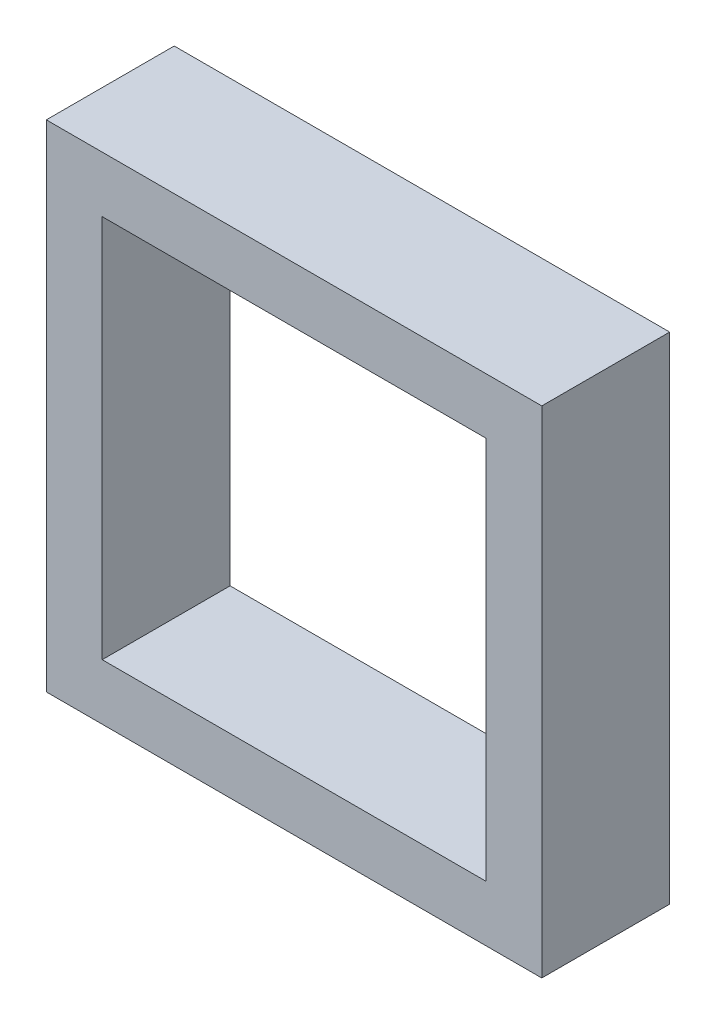
ISO-10303-21;
HEADER;
FILE_DESCRIPTION(('STEP AP214'),'2;1');
FILE_NAME('part.step','',(''),(''),'','','');
FILE_SCHEMA(('AUTOMOTIVE_DESIGN { 1 0 10303 214 1 1 1 1 }'));
ENDSEC;
DATA;
#1=APPLICATION_CONTEXT('core data for automotive mechanical design processes');
#2=APPLICATION_PROTOCOL_DEFINITION('international standard','automotive_design',2000,#1);
#3=PRODUCT_CONTEXT('',#1,'mechanical');
#4=PRODUCT('Part','Part','',(#3));
#5=PRODUCT_RELATED_PRODUCT_CATEGORY('part','',(#4));
#6=PRODUCT_DEFINITION_FORMATION('','',#4);
#7=PRODUCT_DEFINITION_CONTEXT('part definition',#1,'design');
#8=PRODUCT_DEFINITION('design','',#6,#7);
#9=PRODUCT_DEFINITION_SHAPE('','',#8);
#10=(LENGTH_UNIT() NAMED_UNIT(*) SI_UNIT(.MILLI.,.METRE.));
#11=(NAMED_UNIT(*) PLANE_ANGLE_UNIT() SI_UNIT($,.RADIAN.));
#12=(NAMED_UNIT(*) SI_UNIT($,.STERADIAN.) SOLID_ANGLE_UNIT());
#13=UNCERTAINTY_MEASURE_WITH_UNIT(LENGTH_MEASURE(1.E-05),#10,'distance_accuracy_value','');
#14=(GEOMETRIC_REPRESENTATION_CONTEXT(3) GLOBAL_UNCERTAINTY_ASSIGNED_CONTEXT((#13)) GLOBAL_UNIT_ASSIGNED_CONTEXT((#10,
#11,#12)) REPRESENTATION_CONTEXT('',''));
#15=CARTESIAN_POINT('',(0.,0.,0.));
#16=DIRECTION('',(0.,0.,1.));
#17=DIRECTION('',(1.,0.,0.));
#18=AXIS2_PLACEMENT_3D('',#15,#16,#17);
#19=CARTESIAN_POINT('',(0.,0.,10.));
#20=DIRECTION('',(0.,0.,-1.));
#21=DIRECTION('',(-1.,0.,0.));
#22=AXIS2_PLACEMENT_3D('',#19,#20,#21);
#23=PLANE('',#22);
#24=DIRECTION('',(0.,-1.,0.));
#25=VECTOR('',#24,1.);
#26=CARTESIAN_POINT('',(-19.3689392315604,19.3689392315604,10.));
#27=LINE('',#26,#25);
#28=CARTESIAN_POINT('',(-19.3689392315604,19.3689392315604,10.));
#29=VERTEX_POINT('',#28);
#30=CARTESIAN_POINT('',(-19.3689392315604,-19.3689392315603,10.));
#31=VERTEX_POINT('',#30);
#32=EDGE_CURVE('E134',#29,#31,#27,.T.);
#33=ORIENTED_EDGE('',*,*,#32,.T.);
#34=DIRECTION('',(1.,0.,0.));
#35=VECTOR('',#34,1.);
#36=CARTESIAN_POINT('',(19.3689392315604,-19.3689392315603,10.));
#37=LINE('',#36,#35);
#38=CARTESIAN_POINT('',(19.3689392315604,-19.3689392315603,10.));
#39=VERTEX_POINT('',#38);
#40=EDGE_CURVE('E137',#31,#39,#37,.T.);
#41=ORIENTED_EDGE('',*,*,#40,.T.);
#42=DIRECTION('',(0.,1.,0.));
#43=VECTOR('',#42,1.);
#44=CARTESIAN_POINT('',(19.3689392315604,19.3689392315604,10.));
#45=LINE('',#44,#43);
#46=CARTESIAN_POINT('',(19.3689392315604,19.3689392315604,10.));
#47=VERTEX_POINT('',#46);
#48=EDGE_CURVE('E140',#39,#47,#45,.T.);
#49=ORIENTED_EDGE('',*,*,#48,.T.);
#50=DIRECTION('',(-1.,0.,0.));
#51=VECTOR('',#50,1.);
#52=CARTESIAN_POINT('',(19.3689392315604,19.3689392315604,10.));
#53=LINE('',#52,#51);
#54=EDGE_CURVE('E142',#47,#29,#53,.T.);
#55=ORIENTED_EDGE('',*,*,#54,.T.);
#56=EDGE_LOOP('',(#33,#41,#49,#55));
#57=FACE_BOUND('',#56,.T.);
#58=DIRECTION('',(0.,1.,0.));
#59=VECTOR('',#58,1.);
#60=CARTESIAN_POINT('',(15.,15.,10.));
#61=LINE('',#60,#59);
#62=CARTESIAN_POINT('',(15.,-15.,10.));
#63=VERTEX_POINT('',#62);
#64=CARTESIAN_POINT('',(15.,15.,10.));
#65=VERTEX_POINT('',#64);
#66=EDGE_CURVE('E98',#63,#65,#61,.T.);
#67=ORIENTED_EDGE('',*,*,#66,.F.);
#68=DIRECTION('',(1.,0.,0.));
#69=VECTOR('',#68,1.);
#70=CARTESIAN_POINT('',(-15.,-15.,10.));
#71=LINE('',#70,#69);
#72=CARTESIAN_POINT('',(-15.,-15.,10.));
#73=VERTEX_POINT('',#72);
#74=EDGE_CURVE('E120',#73,#63,#71,.T.);
#75=ORIENTED_EDGE('',*,*,#74,.F.);
#76=DIRECTION('',(0.,-1.,0.));
#77=VECTOR('',#76,1.);
#78=CARTESIAN_POINT('',(-15.,15.,10.));
#79=LINE('',#78,#77);
#80=CARTESIAN_POINT('',(-15.,15.,10.));
#81=VERTEX_POINT('',#80);
#82=EDGE_CURVE('E118',#81,#73,#79,.T.);
#83=ORIENTED_EDGE('',*,*,#82,.F.);
#84=DIRECTION('',(-1.,0.,0.));
#85=VECTOR('',#84,1.);
#86=CARTESIAN_POINT('',(-15.,15.,10.));
#87=LINE('',#86,#85);
#88=EDGE_CURVE('E106',#65,#81,#87,.T.);
#89=ORIENTED_EDGE('',*,*,#88,.F.);
#90=EDGE_LOOP('',(#67,#75,#83,#89));
#91=FACE_BOUND('',#90,.T.);
#92=ADVANCED_FACE('F33',(#57,#91),#23,.F.);
#93=CARTESIAN_POINT('',(0.,0.,0.));
#94=DIRECTION('',(0.,0.,-1.));
#95=DIRECTION('',(-1.,0.,0.));
#96=AXIS2_PLACEMENT_3D('',#93,#94,#95);
#97=PLANE('',#96);
#98=DIRECTION('',(0.,-1.,0.));
#99=VECTOR('',#98,1.);
#100=CARTESIAN_POINT('',(-19.3689392315604,19.3689392315604,0.));
#101=LINE('',#100,#99);
#102=CARTESIAN_POINT('',(-19.3689392315604,19.3689392315604,0.));
#103=VERTEX_POINT('',#102);
#104=CARTESIAN_POINT('',(-19.3689392315604,-19.3689392315603,0.));
#105=VERTEX_POINT('',#104);
#106=EDGE_CURVE('E114',#103,#105,#101,.T.);
#107=ORIENTED_EDGE('',*,*,#106,.F.);
#108=DIRECTION('',(-1.,0.,0.));
#109=VECTOR('',#108,1.);
#110=CARTESIAN_POINT('',(19.3689392315604,19.3689392315604,0.));
#111=LINE('',#110,#109);
#112=CARTESIAN_POINT('',(19.3689392315604,19.3689392315604,0.));
#113=VERTEX_POINT('',#112);
#114=EDGE_CURVE('E138',#113,#103,#111,.T.);
#115=ORIENTED_EDGE('',*,*,#114,.F.);
#116=DIRECTION('',(0.,1.,0.));
#117=VECTOR('',#116,1.);
#118=CARTESIAN_POINT('',(19.3689392315604,19.3689392315604,0.));
#119=LINE('',#118,#117);
#120=CARTESIAN_POINT('',(19.3689392315604,-19.3689392315603,0.));
#121=VERTEX_POINT('',#120);
#122=EDGE_CURVE('E149',#121,#113,#119,.T.);
#123=ORIENTED_EDGE('',*,*,#122,.F.);
#124=DIRECTION('',(1.,0.,0.));
#125=VECTOR('',#124,1.);
#126=CARTESIAN_POINT('',(19.3689392315604,-19.3689392315603,0.));
#127=LINE('',#126,#125);
#128=EDGE_CURVE('E147',#105,#121,#127,.T.);
#129=ORIENTED_EDGE('',*,*,#128,.F.);
#130=EDGE_LOOP('',(#107,#115,#123,#129));
#131=FACE_BOUND('',#130,.T.);
#132=DIRECTION('',(1.,0.,0.));
#133=VECTOR('',#132,1.);
#134=CARTESIAN_POINT('',(-15.,-15.,0.));
#135=LINE('',#134,#133);
#136=CARTESIAN_POINT('',(-15.,-15.,0.));
#137=VERTEX_POINT('',#136);
#138=CARTESIAN_POINT('',(15.,-15.,0.));
#139=VERTEX_POINT('',#138);
#140=EDGE_CURVE('E107',#137,#139,#135,.T.);
#141=ORIENTED_EDGE('',*,*,#140,.T.);
#142=DIRECTION('',(0.,1.,0.));
#143=VECTOR('',#142,1.);
#144=CARTESIAN_POINT('',(15.,15.,0.));
#145=LINE('',#144,#143);
#146=CARTESIAN_POINT('',(15.,15.,0.));
#147=VERTEX_POINT('',#146);
#148=EDGE_CURVE('E56',#139,#147,#145,.T.);
#149=ORIENTED_EDGE('',*,*,#148,.T.);
#150=DIRECTION('',(-1.,0.,0.));
#151=VECTOR('',#150,1.);
#152=CARTESIAN_POINT('',(-15.,15.,0.));
#153=LINE('',#152,#151);
#154=CARTESIAN_POINT('',(-15.,15.,0.));
#155=VERTEX_POINT('',#154);
#156=EDGE_CURVE('E113',#147,#155,#153,.T.);
#157=ORIENTED_EDGE('',*,*,#156,.T.);
#158=DIRECTION('',(0.,-1.,0.));
#159=VECTOR('',#158,1.);
#160=CARTESIAN_POINT('',(-15.,15.,0.));
#161=LINE('',#160,#159);
#162=EDGE_CURVE('E126',#155,#137,#161,.T.);
#163=ORIENTED_EDGE('',*,*,#162,.T.);
#164=EDGE_LOOP('',(#141,#149,#157,#163));
#165=FACE_BOUND('',#164,.T.);
#166=ADVANCED_FACE('F167',(#131,#165),#97,.T.);
#167=CARTESIAN_POINT('',(-19.3689392315604,19.3689392315604,10.));
#168=DIRECTION('',(1.,0.,0.));
#169=DIRECTION('',(0.,0.,-1.));
#170=AXIS2_PLACEMENT_3D('',#167,#168,#169);
#171=PLANE('',#170);
#172=ORIENTED_EDGE('',*,*,#106,.T.);
#173=DIRECTION('',(0.,0.,-1.));
#174=VECTOR('',#173,1.);
#175=CARTESIAN_POINT('',(-19.3689392315604,-19.3689392315603,10.));
#176=LINE('',#175,#174);
#177=EDGE_CURVE('E11',#31,#105,#176,.T.);
#178=ORIENTED_EDGE('',*,*,#177,.F.);
#179=ORIENTED_EDGE('',*,*,#32,.F.);
#180=DIRECTION('',(0.,0.,-1.));
#181=VECTOR('',#180,1.);
#182=CARTESIAN_POINT('',(-19.3689392315604,19.3689392315604,10.));
#183=LINE('',#182,#181);
#184=EDGE_CURVE('E144',#29,#103,#183,.T.);
#185=ORIENTED_EDGE('',*,*,#184,.T.);
#186=EDGE_LOOP('',(#172,#178,#179,#185));
#187=FACE_BOUND('',#186,.T.);
#188=ADVANCED_FACE('F35',(#187),#171,.F.);
#189=CARTESIAN_POINT('',(19.3689392315604,-19.3689392315603,10.));
#190=DIRECTION('',(0.,1.,0.));
#191=DIRECTION('',(0.,0.,1.));
#192=AXIS2_PLACEMENT_3D('',#189,#190,#191);
#193=PLANE('',#192);
#194=ORIENTED_EDGE('',*,*,#128,.T.);
#195=DIRECTION('',(0.,0.,-1.));
#196=VECTOR('',#195,1.);
#197=CARTESIAN_POINT('',(19.3689392315604,-19.3689392315603,10.));
#198=LINE('',#197,#196);
#199=EDGE_CURVE('E41',#39,#121,#198,.T.);
#200=ORIENTED_EDGE('',*,*,#199,.F.);
#201=ORIENTED_EDGE('',*,*,#40,.F.);
#202=ORIENTED_EDGE('',*,*,#177,.T.);
#203=EDGE_LOOP('',(#194,#200,#201,#202));
#204=FACE_BOUND('',#203,.T.);
#205=ADVANCED_FACE('F177',(#204),#193,.F.);
#206=CARTESIAN_POINT('',(19.3689392315604,19.3689392315604,10.));
#207=DIRECTION('',(-1.,0.,0.));
#208=DIRECTION('',(0.,0.,1.));
#209=AXIS2_PLACEMENT_3D('',#206,#207,#208);
#210=PLANE('',#209);
#211=ORIENTED_EDGE('',*,*,#122,.T.);
#212=DIRECTION('',(0.,0.,-1.));
#213=VECTOR('',#212,1.);
#214=CARTESIAN_POINT('',(19.3689392315604,19.3689392315604,10.));
#215=LINE('',#214,#213);
#216=EDGE_CURVE('E154',#47,#113,#215,.T.);
#217=ORIENTED_EDGE('',*,*,#216,.F.);
#218=ORIENTED_EDGE('',*,*,#48,.F.);
#219=ORIENTED_EDGE('',*,*,#199,.T.);
#220=EDGE_LOOP('',(#211,#217,#218,#219));
#221=FACE_BOUND('',#220,.T.);
#222=ADVANCED_FACE('F161',(#221),#210,.F.);
#223=CARTESIAN_POINT('',(19.3689392315604,19.3689392315604,10.));
#224=DIRECTION('',(0.,-1.,0.));
#225=DIRECTION('',(0.,0.,-1.));
#226=AXIS2_PLACEMENT_3D('',#223,#224,#225);
#227=PLANE('',#226);
#228=ORIENTED_EDGE('',*,*,#114,.T.);
#229=ORIENTED_EDGE('',*,*,#184,.F.);
#230=ORIENTED_EDGE('',*,*,#54,.F.);
#231=ORIENTED_EDGE('',*,*,#216,.T.);
#232=EDGE_LOOP('',(#228,#229,#230,#231));
#233=FACE_BOUND('',#232,.T.);
#234=ADVANCED_FACE('F171',(#233),#227,.F.);
#235=CARTESIAN_POINT('',(15.,15.,10.));
#236=DIRECTION('',(-1.,0.,0.));
#237=DIRECTION('',(0.,0.,1.));
#238=AXIS2_PLACEMENT_3D('',#235,#236,#237);
#239=PLANE('',#238);
#240=ORIENTED_EDGE('',*,*,#148,.F.);
#241=DIRECTION('',(0.,0.,-1.));
#242=VECTOR('',#241,1.);
#243=CARTESIAN_POINT('',(15.,-15.,10.));
#244=LINE('',#243,#242);
#245=EDGE_CURVE('E102',#63,#139,#244,.T.);
#246=ORIENTED_EDGE('',*,*,#245,.F.);
#247=ORIENTED_EDGE('',*,*,#66,.T.);
#248=DIRECTION('',(0.,0.,-1.));
#249=VECTOR('',#248,1.);
#250=CARTESIAN_POINT('',(15.,15.,10.));
#251=LINE('',#250,#249);
#252=EDGE_CURVE('E101',#65,#147,#251,.T.);
#253=ORIENTED_EDGE('',*,*,#252,.T.);
#254=EDGE_LOOP('',(#240,#246,#247,#253));
#255=FACE_BOUND('',#254,.T.);
#256=ADVANCED_FACE('F100',(#255),#239,.T.);
#257=CARTESIAN_POINT('',(-15.,15.,10.));
#258=DIRECTION('',(0.,-1.,0.));
#259=DIRECTION('',(0.,0.,-1.));
#260=AXIS2_PLACEMENT_3D('',#257,#258,#259);
#261=PLANE('',#260);
#262=ORIENTED_EDGE('',*,*,#156,.F.);
#263=ORIENTED_EDGE('',*,*,#252,.F.);
#264=ORIENTED_EDGE('',*,*,#88,.T.);
#265=DIRECTION('',(0.,0.,-1.));
#266=VECTOR('',#265,1.);
#267=CARTESIAN_POINT('',(-15.,15.,10.));
#268=LINE('',#267,#266);
#269=EDGE_CURVE('E115',#81,#155,#268,.T.);
#270=ORIENTED_EDGE('',*,*,#269,.T.);
#271=EDGE_LOOP('',(#262,#263,#264,#270));
#272=FACE_BOUND('',#271,.T.);
#273=ADVANCED_FACE('F110',(#272),#261,.T.);
#274=CARTESIAN_POINT('',(-15.,15.,10.));
#275=DIRECTION('',(1.,0.,0.));
#276=DIRECTION('',(0.,0.,-1.));
#277=AXIS2_PLACEMENT_3D('',#274,#275,#276);
#278=PLANE('',#277);
#279=ORIENTED_EDGE('',*,*,#162,.F.);
#280=ORIENTED_EDGE('',*,*,#269,.F.);
#281=ORIENTED_EDGE('',*,*,#82,.T.);
#282=DIRECTION('',(0.,0.,-1.));
#283=VECTOR('',#282,1.);
#284=CARTESIAN_POINT('',(-15.,-15.,10.));
#285=LINE('',#284,#283);
#286=EDGE_CURVE('E48',#73,#137,#285,.T.);
#287=ORIENTED_EDGE('',*,*,#286,.T.);
#288=EDGE_LOOP('',(#279,#280,#281,#287));
#289=FACE_BOUND('',#288,.T.);
#290=ADVANCED_FACE('F200',(#289),#278,.T.);
#291=CARTESIAN_POINT('',(-15.,-15.,10.));
#292=DIRECTION('',(0.,1.,0.));
#293=DIRECTION('',(0.,0.,1.));
#294=AXIS2_PLACEMENT_3D('',#291,#292,#293);
#295=PLANE('',#294);
#296=ORIENTED_EDGE('',*,*,#140,.F.);
#297=ORIENTED_EDGE('',*,*,#286,.F.);
#298=ORIENTED_EDGE('',*,*,#74,.T.);
#299=ORIENTED_EDGE('',*,*,#245,.T.);
#300=EDGE_LOOP('',(#296,#297,#298,#299));
#301=FACE_BOUND('',#300,.T.);
#302=ADVANCED_FACE('F204',(#301),#295,.T.);
#303=CLOSED_SHELL('',(#92,#166,#188,#205,#222,#234,#256,#273,#290,#302));
#304=MANIFOLD_SOLID_BREP('B2',#303);
#305=ADVANCED_BREP_SHAPE_REPRESENTATION('',(#18,#304),#14);
#306=SHAPE_DEFINITION_REPRESENTATION(#9,#305);
ENDSEC;
END-ISO-10303-21;
